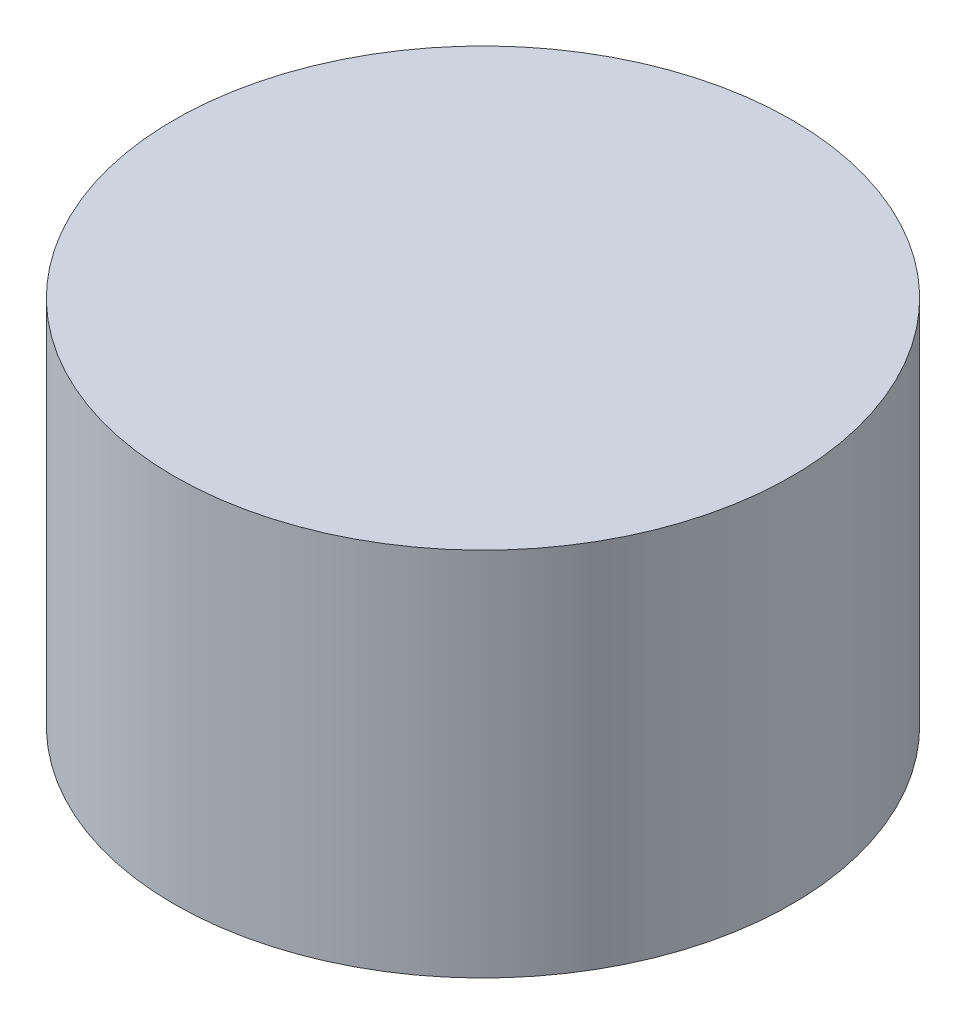
ISO-10303-21;
HEADER;
FILE_DESCRIPTION(('STEP AP214'),'2;1');
FILE_NAME('part.step','',(''),(''),'','','');
FILE_SCHEMA(('AUTOMOTIVE_DESIGN { 1 0 10303 214 1 1 1 1 }'));
ENDSEC;
DATA;
#1=APPLICATION_CONTEXT('core data for automotive mechanical design processes');
#2=APPLICATION_PROTOCOL_DEFINITION('international standard','automotive_design',2000,#1);
#3=PRODUCT_CONTEXT('',#1,'mechanical');
#4=PRODUCT('Part','Part','',(#3));
#5=PRODUCT_RELATED_PRODUCT_CATEGORY('part','',(#4));
#6=PRODUCT_DEFINITION_FORMATION('','',#4);
#7=PRODUCT_DEFINITION_CONTEXT('part definition',#1,'design');
#8=PRODUCT_DEFINITION('design','',#6,#7);
#9=PRODUCT_DEFINITION_SHAPE('','',#8);
#10=(LENGTH_UNIT() NAMED_UNIT(*) SI_UNIT(.MILLI.,.METRE.));
#11=(NAMED_UNIT(*) PLANE_ANGLE_UNIT() SI_UNIT($,.RADIAN.));
#12=(NAMED_UNIT(*) SI_UNIT($,.STERADIAN.) SOLID_ANGLE_UNIT());
#13=UNCERTAINTY_MEASURE_WITH_UNIT(LENGTH_MEASURE(1.E-05),#10,'distance_accuracy_value','');
#14=(GEOMETRIC_REPRESENTATION_CONTEXT(3) GLOBAL_UNCERTAINTY_ASSIGNED_CONTEXT((#13)) GLOBAL_UNIT_ASSIGNED_CONTEXT((#10,
#11,#12)) REPRESENTATION_CONTEXT('',''));
#15=CARTESIAN_POINT('',(0.,0.,0.));
#16=DIRECTION('',(0.,0.,1.));
#17=DIRECTION('',(1.,0.,0.));
#18=AXIS2_PLACEMENT_3D('',#15,#16,#17);
#19=CARTESIAN_POINT('',(0.,300.,0.));
#20=DIRECTION('',(0.,-1.,0.));
#21=DIRECTION('',(0.,0.,-1.));
#22=AXIS2_PLACEMENT_3D('',#19,#20,#21);
#23=CYLINDRICAL_SURFACE('',#22,250.);
#24=CARTESIAN_POINT('',(0.,300.,0.));
#25=DIRECTION('',(0.,1.,0.));
#26=DIRECTION('',(0.,0.,1.));
#27=AXIS2_PLACEMENT_3D('',#24,#25,#26);
#28=CIRCLE('',#27,250.);
#29=CARTESIAN_POINT('',(0.,300.,250.));
#30=VERTEX_POINT('',#29);
#31=EDGE_CURVE('E10',#30,#30,#28,.T.);
#32=ORIENTED_EDGE('',*,*,#31,.F.);
#33=EDGE_LOOP('',(#32));
#34=FACE_BOUND('',#33,.T.);
#35=CARTESIAN_POINT('',(0.,0.,0.));
#36=DIRECTION('',(0.,1.,0.));
#37=DIRECTION('',(0.,0.,1.));
#38=AXIS2_PLACEMENT_3D('',#35,#36,#37);
#39=CIRCLE('',#38,250.);
#40=CARTESIAN_POINT('',(0.,0.,250.));
#41=VERTEX_POINT('',#40);
#42=EDGE_CURVE('E42',#41,#41,#39,.T.);
#43=ORIENTED_EDGE('',*,*,#42,.T.);
#44=EDGE_LOOP('',(#43));
#45=FACE_BOUND('',#44,.T.);
#46=ADVANCED_FACE('F39',(#34,#45),#23,.T.);
#47=CARTESIAN_POINT('',(0.,300.,0.));
#48=DIRECTION('',(0.,1.,0.));
#49=DIRECTION('',(0.,0.,1.));
#50=AXIS2_PLACEMENT_3D('',#47,#48,#49);
#51=PLANE('',#50);
#52=ORIENTED_EDGE('',*,*,#31,.T.);
#53=EDGE_LOOP('',(#52));
#54=FACE_BOUND('',#53,.T.);
#55=ADVANCED_FACE('F54',(#54),#51,.T.);
#56=CARTESIAN_POINT('',(0.,0.,0.));
#57=DIRECTION('',(0.,1.,0.));
#58=DIRECTION('',(0.,0.,1.));
#59=AXIS2_PLACEMENT_3D('',#56,#57,#58);
#60=PLANE('',#59);
#61=ORIENTED_EDGE('',*,*,#42,.F.);
#62=EDGE_LOOP('',(#61));
#63=FACE_BOUND('',#62,.T.);
#64=ADVANCED_FACE('F52',(#63),#60,.F.);
#65=CLOSED_SHELL('',(#46,#55,#64));
#66=MANIFOLD_SOLID_BREP('B2',#65);
#67=ADVANCED_BREP_SHAPE_REPRESENTATION('',(#18,#66),#14);
#68=SHAPE_DEFINITION_REPRESENTATION(#9,#67);
ENDSEC;
END-ISO-10303-21;
